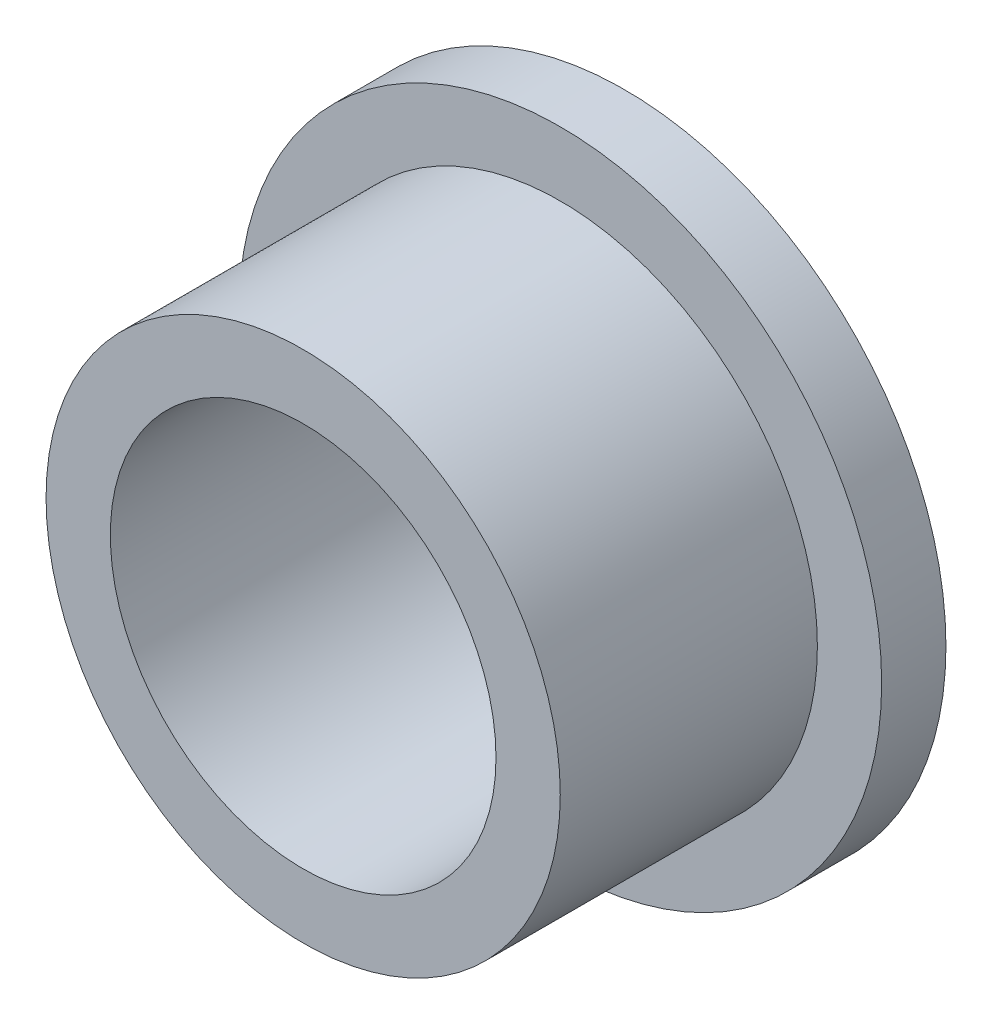
ISO-10303-21;
HEADER;
FILE_DESCRIPTION(('STEP AP214'),'2;1');
FILE_NAME('part.step','',(''),(''),'','','');
FILE_SCHEMA(('AUTOMOTIVE_DESIGN { 1 0 10303 214 1 1 1 1 }'));
ENDSEC;
DATA;
#1=APPLICATION_CONTEXT('core data for automotive mechanical design processes');
#2=APPLICATION_PROTOCOL_DEFINITION('international standard','automotive_design',2000,#1);
#3=PRODUCT_CONTEXT('',#1,'mechanical');
#4=PRODUCT('Part','Part','',(#3));
#5=PRODUCT_RELATED_PRODUCT_CATEGORY('part','',(#4));
#6=PRODUCT_DEFINITION_FORMATION('','',#4);
#7=PRODUCT_DEFINITION_CONTEXT('part definition',#1,'design');
#8=PRODUCT_DEFINITION('design','',#6,#7);
#9=PRODUCT_DEFINITION_SHAPE('','',#8);
#10=(LENGTH_UNIT() NAMED_UNIT(*) SI_UNIT(.MILLI.,.METRE.));
#11=(NAMED_UNIT(*) PLANE_ANGLE_UNIT() SI_UNIT($,.RADIAN.));
#12=(NAMED_UNIT(*) SI_UNIT($,.STERADIAN.) SOLID_ANGLE_UNIT());
#13=UNCERTAINTY_MEASURE_WITH_UNIT(LENGTH_MEASURE(1.E-05),#10,'distance_accuracy_value','');
#14=(GEOMETRIC_REPRESENTATION_CONTEXT(3) GLOBAL_UNCERTAINTY_ASSIGNED_CONTEXT((#13)) GLOBAL_UNIT_ASSIGNED_CONTEXT((#10,
#11,#12)) REPRESENTATION_CONTEXT('',''));
#15=CARTESIAN_POINT('',(0.,0.,0.));
#16=DIRECTION('',(0.,0.,1.));
#17=DIRECTION('',(1.,0.,0.));
#18=AXIS2_PLACEMENT_3D('',#15,#16,#17);
#19=CARTESIAN_POINT('',(0.,0.,1.));
#20=DIRECTION('',(0.,0.,1.));
#21=DIRECTION('',(1.,0.,0.));
#22=AXIS2_PLACEMENT_3D('',#19,#20,#21);
#23=PLANE('',#22);
#24=CARTESIAN_POINT('',(0.,0.,1.));
#25=DIRECTION('',(0.,0.,1.));
#26=DIRECTION('',(1.,0.,0.));
#27=AXIS2_PLACEMENT_3D('',#24,#25,#26);
#28=CIRCLE('',#27,5.);
#29=CARTESIAN_POINT('',(5.,0.,1.));
#30=VERTEX_POINT('',#29);
#31=EDGE_CURVE('E10',#30,#30,#28,.T.);
#32=ORIENTED_EDGE('',*,*,#31,.T.);
#33=EDGE_LOOP('',(#32));
#34=FACE_BOUND('',#33,.T.);
#35=CARTESIAN_POINT('',(0.,0.,1.));
#36=DIRECTION('',(0.,0.,1.));
#37=DIRECTION('',(1.,0.,0.));
#38=AXIS2_PLACEMENT_3D('',#35,#36,#37);
#39=CIRCLE('',#38,4.);
#40=CARTESIAN_POINT('',(4.,0.,1.));
#41=VERTEX_POINT('',#40);
#42=EDGE_CURVE('E55',#41,#41,#39,.F.);
#43=ORIENTED_EDGE('',*,*,#42,.T.);
#44=EDGE_LOOP('',(#43));
#45=FACE_BOUND('',#44,.T.);
#46=ADVANCED_FACE('F37',(#34,#45),#23,.T.);
#47=CARTESIAN_POINT('',(0.,0.,0.));
#48=DIRECTION('',(0.,0.,1.));
#49=DIRECTION('',(1.,0.,0.));
#50=AXIS2_PLACEMENT_3D('',#47,#48,#49);
#51=PLANE('',#50);
#52=CARTESIAN_POINT('',(0.,0.,0.));
#53=DIRECTION('',(0.,0.,1.));
#54=DIRECTION('',(1.,0.,0.));
#55=AXIS2_PLACEMENT_3D('',#52,#53,#54);
#56=CIRCLE('',#55,3.);
#57=CARTESIAN_POINT('',(3.,0.,0.));
#58=VERTEX_POINT('',#57);
#59=EDGE_CURVE('E50',#58,#58,#56,.T.);
#60=ORIENTED_EDGE('',*,*,#59,.T.);
#61=EDGE_LOOP('',(#60));
#62=FACE_BOUND('',#61,.T.);
#63=CARTESIAN_POINT('',(0.,0.,0.));
#64=DIRECTION('',(0.,0.,1.));
#65=DIRECTION('',(1.,0.,0.));
#66=AXIS2_PLACEMENT_3D('',#63,#64,#65);
#67=CIRCLE('',#66,5.);
#68=CARTESIAN_POINT('',(5.,0.,0.));
#69=VERTEX_POINT('',#68);
#70=EDGE_CURVE('E41',#69,#69,#67,.T.);
#71=ORIENTED_EDGE('',*,*,#70,.F.);
#72=EDGE_LOOP('',(#71));
#73=FACE_BOUND('',#72,.T.);
#74=ADVANCED_FACE('F84',(#62,#73),#51,.F.);
#75=CARTESIAN_POINT('',(0.,0.,1.));
#76=DIRECTION('',(0.,0.,-1.));
#77=DIRECTION('',(-1.,0.,0.));
#78=AXIS2_PLACEMENT_3D('',#75,#76,#77);
#79=CYLINDRICAL_SURFACE('',#78,5.);
#80=ORIENTED_EDGE('',*,*,#31,.F.);
#81=EDGE_LOOP('',(#80));
#82=FACE_BOUND('',#81,.T.);
#83=ORIENTED_EDGE('',*,*,#70,.T.);
#84=EDGE_LOOP('',(#83));
#85=FACE_BOUND('',#84,.T.);
#86=ADVANCED_FACE('F39',(#82,#85),#79,.T.);
#87=CARTESIAN_POINT('',(0.,0.,1.));
#88=DIRECTION('',(0.,0.,-1.));
#89=DIRECTION('',(-1.,0.,0.));
#90=AXIS2_PLACEMENT_3D('',#87,#88,#89);
#91=CYLINDRICAL_SURFACE('',#90,3.);
#92=ORIENTED_EDGE('',*,*,#59,.F.);
#93=EDGE_LOOP('',(#92));
#94=FACE_BOUND('',#93,.T.);
#95=CARTESIAN_POINT('',(0.,0.,5.));
#96=DIRECTION('',(0.,0.,1.));
#97=DIRECTION('',(1.,0.,0.));
#98=AXIS2_PLACEMENT_3D('',#95,#96,#97);
#99=CIRCLE('',#98,3.);
#100=CARTESIAN_POINT('',(3.,0.,5.));
#101=VERTEX_POINT('',#100);
#102=EDGE_CURVE('E63',#101,#101,#99,.T.);
#103=ORIENTED_EDGE('',*,*,#102,.T.);
#104=EDGE_LOOP('',(#103));
#105=FACE_BOUND('',#104,.T.);
#106=ADVANCED_FACE('F68',(#94,#105),#91,.F.);
#107=CARTESIAN_POINT('',(0.,0.,5.));
#108=DIRECTION('',(0.,0.,1.));
#109=DIRECTION('',(1.,0.,0.));
#110=AXIS2_PLACEMENT_3D('',#107,#108,#109);
#111=PLANE('',#110);
#112=CARTESIAN_POINT('',(0.,0.,5.));
#113=DIRECTION('',(0.,0.,1.));
#114=DIRECTION('',(1.,0.,0.));
#115=AXIS2_PLACEMENT_3D('',#112,#113,#114);
#116=CIRCLE('',#115,4.);
#117=CARTESIAN_POINT('',(4.,0.,5.));
#118=VERTEX_POINT('',#117);
#119=EDGE_CURVE('E59',#118,#118,#116,.T.);
#120=ORIENTED_EDGE('',*,*,#119,.T.);
#121=EDGE_LOOP('',(#120));
#122=FACE_BOUND('',#121,.T.);
#123=ORIENTED_EDGE('',*,*,#102,.F.);
#124=EDGE_LOOP('',(#123));
#125=FACE_BOUND('',#124,.T.);
#126=ADVANCED_FACE('F70',(#122,#125),#111,.T.);
#127=CARTESIAN_POINT('',(0.,0.,5.));
#128=DIRECTION('',(0.,0.,-1.));
#129=DIRECTION('',(-1.,0.,0.));
#130=AXIS2_PLACEMENT_3D('',#127,#128,#129);
#131=CYLINDRICAL_SURFACE('',#130,4.);
#132=ORIENTED_EDGE('',*,*,#42,.F.);
#133=EDGE_LOOP('',(#132));
#134=FACE_BOUND('',#133,.T.);
#135=ORIENTED_EDGE('',*,*,#119,.F.);
#136=EDGE_LOOP('',(#135));
#137=FACE_BOUND('',#136,.T.);
#138=ADVANCED_FACE('F72',(#134,#137),#131,.T.);
#139=CLOSED_SHELL('',(#46,#74,#86,#106,#126,#138));
#140=MANIFOLD_SOLID_BREP('B2',#139);
#141=ADVANCED_BREP_SHAPE_REPRESENTATION('',(#18,#140),#14);
#142=SHAPE_DEFINITION_REPRESENTATION(#9,#141);
ENDSEC;
END-ISO-10303-21;
